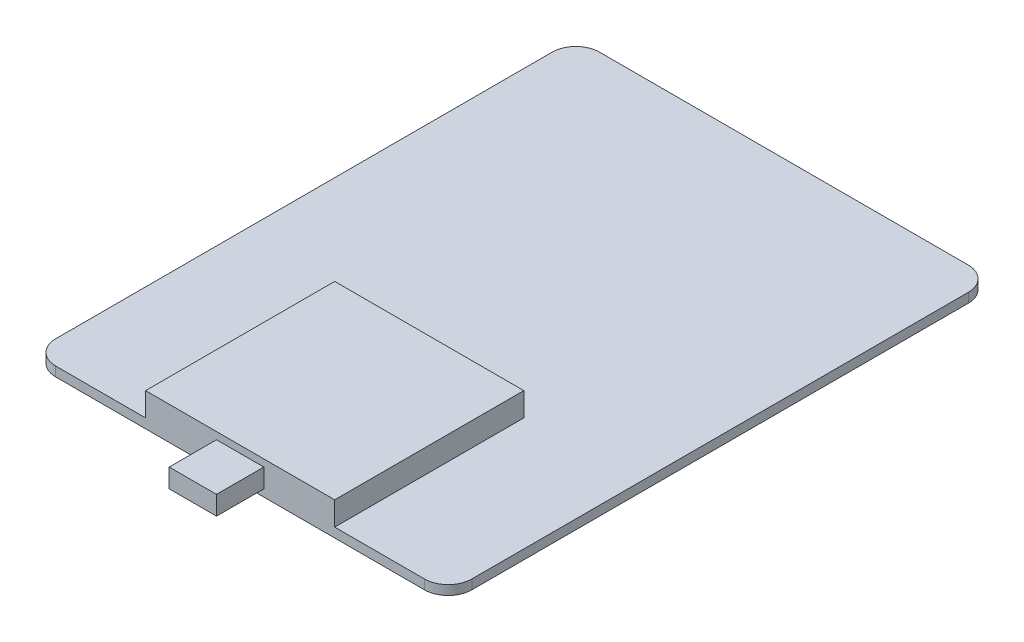
ISO-10303-21;
HEADER;
FILE_DESCRIPTION(('STEP AP214'),'2;1');
FILE_NAME('part.step','',(''),(''),'','','');
FILE_SCHEMA(('AUTOMOTIVE_DESIGN { 1 0 10303 214 1 1 1 1 }'));
ENDSEC;
DATA;
#1=APPLICATION_CONTEXT('core data for automotive mechanical design processes');
#2=APPLICATION_PROTOCOL_DEFINITION('international standard','automotive_design',2000,#1);
#3=PRODUCT_CONTEXT('',#1,'mechanical');
#4=PRODUCT('Part','Part','',(#3));
#5=PRODUCT_RELATED_PRODUCT_CATEGORY('part','',(#4));
#6=PRODUCT_DEFINITION_FORMATION('','',#4);
#7=PRODUCT_DEFINITION_CONTEXT('part definition',#1,'design');
#8=PRODUCT_DEFINITION('design','',#6,#7);
#9=PRODUCT_DEFINITION_SHAPE('','',#8);
#10=(LENGTH_UNIT() NAMED_UNIT(*) SI_UNIT(.MILLI.,.METRE.));
#11=(NAMED_UNIT(*) PLANE_ANGLE_UNIT() SI_UNIT($,.RADIAN.));
#12=(NAMED_UNIT(*) SI_UNIT($,.STERADIAN.) SOLID_ANGLE_UNIT());
#13=UNCERTAINTY_MEASURE_WITH_UNIT(LENGTH_MEASURE(1.E-05),#10,'distance_accuracy_value','');
#14=(GEOMETRIC_REPRESENTATION_CONTEXT(3) GLOBAL_UNCERTAINTY_ASSIGNED_CONTEXT((#13)) GLOBAL_UNIT_ASSIGNED_CONTEXT((#10,
#11,#12)) REPRESENTATION_CONTEXT('',''));
#15=CARTESIAN_POINT('',(0.,0.,0.));
#16=DIRECTION('',(0.,0.,1.));
#17=DIRECTION('',(1.,0.,0.));
#18=AXIS2_PLACEMENT_3D('',#15,#16,#17);
#19=CARTESIAN_POINT('',(39.,2.,57.5));
#20=DIRECTION('',(0.,0.,-1.));
#21=DIRECTION('',(-1.,0.,0.));
#22=AXIS2_PLACEMENT_3D('',#19,#20,#21);
#23=PLANE('',#22);
#24=DIRECTION('',(1.,0.,0.));
#25=VECTOR('',#24,1.);
#26=CARTESIAN_POINT('',(39.,0.,57.5));
#27=LINE('',#26,#25);
#28=CARTESIAN_POINT('',(-39.,0.,57.5));
#29=VERTEX_POINT('',#28);
#30=CARTESIAN_POINT('',(39.,0.,57.5));
#31=VERTEX_POINT('',#30);
#32=EDGE_CURVE('E232',#29,#31,#27,.T.);
#33=ORIENTED_EDGE('',*,*,#32,.T.);
#34=DIRECTION('',(0.,-1.,0.));
#35=VECTOR('',#34,1.);
#36=CARTESIAN_POINT('',(39.,2.,57.5));
#37=LINE('',#36,#35);
#38=CARTESIAN_POINT('',(39.,2.,57.5));
#39=VERTEX_POINT('',#38);
#40=EDGE_CURVE('E252',#39,#31,#37,.T.);
#41=ORIENTED_EDGE('',*,*,#40,.F.);
#42=DIRECTION('',(1.,0.,0.));
#43=VECTOR('',#42,1.);
#44=CARTESIAN_POINT('',(39.,2.,57.5));
#45=LINE('',#44,#43);
#46=CARTESIAN_POINT('',(20.,2.,57.5));
#47=VERTEX_POINT('',#46);
#48=EDGE_CURVE('E214',#47,#39,#45,.T.);
#49=ORIENTED_EDGE('',*,*,#48,.F.);
#50=DIRECTION('',(0.,-1.,0.));
#51=VECTOR('',#50,1.);
#52=CARTESIAN_POINT('',(20.,7.,57.5));
#53=LINE('',#52,#51);
#54=CARTESIAN_POINT('',(20.,7.,57.5));
#55=VERTEX_POINT('',#54);
#56=EDGE_CURVE('E188',#55,#47,#53,.T.);
#57=ORIENTED_EDGE('',*,*,#56,.F.);
#58=DIRECTION('',(1.,0.,0.));
#59=VECTOR('',#58,1.);
#60=CARTESIAN_POINT('',(20.,7.,57.5));
#61=LINE('',#60,#59);
#62=CARTESIAN_POINT('',(-20.,7.,57.5));
#63=VERTEX_POINT('',#62);
#64=EDGE_CURVE('E187',#63,#55,#61,.T.);
#65=ORIENTED_EDGE('',*,*,#64,.F.);
#66=DIRECTION('',(0.,-1.,0.));
#67=VECTOR('',#66,1.);
#68=CARTESIAN_POINT('',(-20.,7.,57.5));
#69=LINE('',#68,#67);
#70=CARTESIAN_POINT('',(-20.,2.,57.5));
#71=VERTEX_POINT('',#70);
#72=EDGE_CURVE('E196',#63,#71,#69,.T.);
#73=ORIENTED_EDGE('',*,*,#72,.T.);
#74=CARTESIAN_POINT('',(-39.,2.,57.5));
#75=VERTEX_POINT('',#74);
#76=EDGE_CURVE('E215',#75,#71,#45,.T.);
#77=ORIENTED_EDGE('',*,*,#76,.F.);
#78=DIRECTION('',(0.,-1.,0.));
#79=VECTOR('',#78,1.);
#80=CARTESIAN_POINT('',(-39.,2.,57.5));
#81=LINE('',#80,#79);
#82=EDGE_CURVE('E255',#75,#29,#81,.T.);
#83=ORIENTED_EDGE('',*,*,#82,.T.);
#84=EDGE_LOOP('',(#33,#41,#49,#57,#65,#73,#77,#83));
#85=FACE_BOUND('',#84,.T.);
#86=DIRECTION('',(0.,-1.,0.));
#87=VECTOR('',#86,1.);
#88=CARTESIAN_POINT('',(-5.,5.5,57.5));
#89=LINE('',#88,#87);
#90=CARTESIAN_POINT('',(-5.,5.5,57.5));
#91=VERTEX_POINT('',#90);
#92=CARTESIAN_POINT('',(-5.,1.5,57.5));
#93=VERTEX_POINT('',#92);
#94=EDGE_CURVE('E169',#91,#93,#89,.T.);
#95=ORIENTED_EDGE('',*,*,#94,.F.);
#96=DIRECTION('',(-1.,0.,0.));
#97=VECTOR('',#96,1.);
#98=CARTESIAN_POINT('',(5.,5.5,57.5));
#99=LINE('',#98,#97);
#100=CARTESIAN_POINT('',(5.,5.5,57.5));
#101=VERTEX_POINT('',#100);
#102=EDGE_CURVE('E166',#101,#91,#99,.T.);
#103=ORIENTED_EDGE('',*,*,#102,.F.);
#104=DIRECTION('',(0.,1.,0.));
#105=VECTOR('',#104,1.);
#106=CARTESIAN_POINT('',(5.,5.5,57.5));
#107=LINE('',#106,#105);
#108=CARTESIAN_POINT('',(5.,1.5,57.5));
#109=VERTEX_POINT('',#108);
#110=EDGE_CURVE('E56',#109,#101,#107,.T.);
#111=ORIENTED_EDGE('',*,*,#110,.F.);
#112=DIRECTION('',(1.,0.,0.));
#113=VECTOR('',#112,1.);
#114=CARTESIAN_POINT('',(5.,1.5,57.5));
#115=LINE('',#114,#113);
#116=EDGE_CURVE('E51',#93,#109,#115,.T.);
#117=ORIENTED_EDGE('',*,*,#116,.F.);
#118=EDGE_LOOP('',(#95,#103,#111,#117));
#119=FACE_BOUND('',#118,.T.);
#120=ADVANCED_FACE('F36',(#85,#119),#23,.F.);
#121=CARTESIAN_POINT('',(-39.,2.,-52.5));
#122=DIRECTION('',(0.,-1.,0.));
#123=DIRECTION('',(0.,0.,-1.));
#124=AXIS2_PLACEMENT_3D('',#121,#122,#123);
#125=CYLINDRICAL_SURFACE('',#124,5.);
#126=CARTESIAN_POINT('',(-39.,0.,-52.5));
#127=DIRECTION('',(0.,1.,0.));
#128=DIRECTION('',(0.,0.,1.));
#129=AXIS2_PLACEMENT_3D('',#126,#127,#128);
#130=CIRCLE('',#129,5.);
#131=CARTESIAN_POINT('',(-39.,0.,-57.5));
#132=VERTEX_POINT('',#131);
#133=CARTESIAN_POINT('',(-44.,0.,-52.5));
#134=VERTEX_POINT('',#133);
#135=EDGE_CURVE('E205',#132,#134,#130,.T.);
#136=ORIENTED_EDGE('',*,*,#135,.T.);
#137=DIRECTION('',(0.,-1.,0.));
#138=VECTOR('',#137,1.);
#139=CARTESIAN_POINT('',(-44.,2.,-52.5));
#140=LINE('',#139,#138);
#141=CARTESIAN_POINT('',(-44.,2.,-52.5));
#142=VERTEX_POINT('',#141);
#143=EDGE_CURVE('E11',#142,#134,#140,.T.);
#144=ORIENTED_EDGE('',*,*,#143,.F.);
#145=CARTESIAN_POINT('',(-39.,2.,-52.5));
#146=DIRECTION('',(0.,1.,0.));
#147=DIRECTION('',(0.,0.,1.));
#148=AXIS2_PLACEMENT_3D('',#145,#146,#147);
#149=CIRCLE('',#148,5.);
#150=CARTESIAN_POINT('',(-39.,2.,-57.5));
#151=VERTEX_POINT('',#150);
#152=EDGE_CURVE('E206',#151,#142,#149,.T.);
#153=ORIENTED_EDGE('',*,*,#152,.F.);
#154=DIRECTION('',(0.,-1.,0.));
#155=VECTOR('',#154,1.);
#156=CARTESIAN_POINT('',(-39.,2.,-57.5));
#157=LINE('',#156,#155);
#158=EDGE_CURVE('E225',#151,#132,#157,.T.);
#159=ORIENTED_EDGE('',*,*,#158,.T.);
#160=EDGE_LOOP('',(#136,#144,#153,#159));
#161=FACE_BOUND('',#160,.T.);
#162=ADVANCED_FACE('F38',(#161),#125,.T.);
#163=CARTESIAN_POINT('',(-44.,2.,-52.5));
#164=DIRECTION('',(1.,0.,0.));
#165=DIRECTION('',(0.,0.,-1.));
#166=AXIS2_PLACEMENT_3D('',#163,#164,#165);
#167=PLANE('',#166);
#168=DIRECTION('',(0.,0.,1.));
#169=VECTOR('',#168,1.);
#170=CARTESIAN_POINT('',(-44.,0.,-52.5));
#171=LINE('',#170,#169);
#172=CARTESIAN_POINT('',(-44.,0.,52.5));
#173=VERTEX_POINT('',#172);
#174=EDGE_CURVE('E228',#134,#173,#171,.T.);
#175=ORIENTED_EDGE('',*,*,#174,.T.);
#176=DIRECTION('',(0.,-1.,0.));
#177=VECTOR('',#176,1.);
#178=CARTESIAN_POINT('',(-44.,2.,52.5));
#179=LINE('',#178,#177);
#180=CARTESIAN_POINT('',(-44.,2.,52.5));
#181=VERTEX_POINT('',#180);
#182=EDGE_CURVE('E44',#181,#173,#179,.T.);
#183=ORIENTED_EDGE('',*,*,#182,.F.);
#184=DIRECTION('',(0.,0.,1.));
#185=VECTOR('',#184,1.);
#186=CARTESIAN_POINT('',(-44.,2.,-52.5));
#187=LINE('',#186,#185);
#188=EDGE_CURVE('E209',#142,#181,#187,.T.);
#189=ORIENTED_EDGE('',*,*,#188,.F.);
#190=ORIENTED_EDGE('',*,*,#143,.T.);
#191=EDGE_LOOP('',(#175,#183,#189,#190));
#192=FACE_BOUND('',#191,.T.);
#193=ADVANCED_FACE('F311',(#192),#167,.F.);
#194=CARTESIAN_POINT('',(-39.,2.,52.5));
#195=DIRECTION('',(0.,-1.,0.));
#196=DIRECTION('',(0.,0.,-1.));
#197=AXIS2_PLACEMENT_3D('',#194,#195,#196);
#198=CYLINDRICAL_SURFACE('',#197,5.);
#199=CARTESIAN_POINT('',(-39.,0.,52.5));
#200=DIRECTION('',(0.,1.,0.));
#201=DIRECTION('',(0.,0.,-1.));
#202=AXIS2_PLACEMENT_3D('',#199,#200,#201);
#203=CIRCLE('',#202,5.);
#204=EDGE_CURVE('E230',#173,#29,#203,.T.);
#205=ORIENTED_EDGE('',*,*,#204,.T.);
#206=ORIENTED_EDGE('',*,*,#82,.F.);
#207=CARTESIAN_POINT('',(-39.,2.,52.5));
#208=DIRECTION('',(0.,1.,0.));
#209=DIRECTION('',(0.,0.,-1.));
#210=AXIS2_PLACEMENT_3D('',#207,#208,#209);
#211=CIRCLE('',#210,5.);
#212=EDGE_CURVE('E212',#181,#75,#211,.T.);
#213=ORIENTED_EDGE('',*,*,#212,.F.);
#214=ORIENTED_EDGE('',*,*,#182,.T.);
#215=EDGE_LOOP('',(#205,#206,#213,#214));
#216=FACE_BOUND('',#215,.T.);
#217=ADVANCED_FACE('F262',(#216),#198,.T.);
#218=CARTESIAN_POINT('',(39.,2.,52.5));
#219=DIRECTION('',(0.,-1.,0.));
#220=DIRECTION('',(0.,0.,-1.));
#221=AXIS2_PLACEMENT_3D('',#218,#219,#220);
#222=CYLINDRICAL_SURFACE('',#221,5.);
#223=CARTESIAN_POINT('',(39.,0.,52.5));
#224=DIRECTION('',(0.,1.,0.));
#225=DIRECTION('',(0.,0.,-1.));
#226=AXIS2_PLACEMENT_3D('',#223,#224,#225);
#227=CIRCLE('',#226,5.);
#228=CARTESIAN_POINT('',(44.,0.,52.5));
#229=VERTEX_POINT('',#228);
#230=EDGE_CURVE('E234',#31,#229,#227,.T.);
#231=ORIENTED_EDGE('',*,*,#230,.T.);
#232=DIRECTION('',(0.,-1.,0.));
#233=VECTOR('',#232,1.);
#234=CARTESIAN_POINT('',(44.,2.,52.5));
#235=LINE('',#234,#233);
#236=CARTESIAN_POINT('',(44.,2.,52.5));
#237=VERTEX_POINT('',#236);
#238=EDGE_CURVE('E249',#237,#229,#235,.T.);
#239=ORIENTED_EDGE('',*,*,#238,.F.);
#240=CARTESIAN_POINT('',(39.,2.,52.5));
#241=DIRECTION('',(0.,1.,0.));
#242=DIRECTION('',(0.,0.,-1.));
#243=AXIS2_PLACEMENT_3D('',#240,#241,#242);
#244=CIRCLE('',#243,5.);
#245=EDGE_CURVE('E217',#39,#237,#244,.T.);
#246=ORIENTED_EDGE('',*,*,#245,.F.);
#247=ORIENTED_EDGE('',*,*,#40,.T.);
#248=EDGE_LOOP('',(#231,#239,#246,#247));
#249=FACE_BOUND('',#248,.T.);
#250=ADVANCED_FACE('F277',(#249),#222,.T.);
#251=CARTESIAN_POINT('',(44.,2.,-52.5));
#252=DIRECTION('',(-1.,0.,0.));
#253=DIRECTION('',(0.,0.,1.));
#254=AXIS2_PLACEMENT_3D('',#251,#252,#253);
#255=PLANE('',#254);
#256=DIRECTION('',(0.,0.,-1.));
#257=VECTOR('',#256,1.);
#258=CARTESIAN_POINT('',(44.,0.,-52.5));
#259=LINE('',#258,#257);
#260=CARTESIAN_POINT('',(44.,0.,-52.5));
#261=VERTEX_POINT('',#260);
#262=EDGE_CURVE('E236',#229,#261,#259,.T.);
#263=ORIENTED_EDGE('',*,*,#262,.T.);
#264=DIRECTION('',(0.,-1.,0.));
#265=VECTOR('',#264,1.);
#266=CARTESIAN_POINT('',(44.,2.,-52.5));
#267=LINE('',#266,#265);
#268=CARTESIAN_POINT('',(44.,2.,-52.5));
#269=VERTEX_POINT('',#268);
#270=EDGE_CURVE('E246',#269,#261,#267,.T.);
#271=ORIENTED_EDGE('',*,*,#270,.F.);
#272=DIRECTION('',(0.,0.,-1.));
#273=VECTOR('',#272,1.);
#274=CARTESIAN_POINT('',(44.,2.,-52.5));
#275=LINE('',#274,#273);
#276=EDGE_CURVE('E219',#237,#269,#275,.T.);
#277=ORIENTED_EDGE('',*,*,#276,.F.);
#278=ORIENTED_EDGE('',*,*,#238,.T.);
#279=EDGE_LOOP('',(#263,#271,#277,#278));
#280=FACE_BOUND('',#279,.T.);
#281=ADVANCED_FACE('F333',(#280),#255,.F.);
#282=CARTESIAN_POINT('',(39.,2.,-52.5));
#283=DIRECTION('',(0.,-1.,0.));
#284=DIRECTION('',(0.,0.,-1.));
#285=AXIS2_PLACEMENT_3D('',#282,#283,#284);
#286=CYLINDRICAL_SURFACE('',#285,5.);
#287=CARTESIAN_POINT('',(39.,0.,-52.5));
#288=DIRECTION('',(0.,1.,0.));
#289=DIRECTION('',(0.,0.,-1.));
#290=AXIS2_PLACEMENT_3D('',#287,#288,#289);
#291=CIRCLE('',#290,5.);
#292=CARTESIAN_POINT('',(39.,0.,-57.5));
#293=VERTEX_POINT('',#292);
#294=EDGE_CURVE('E238',#261,#293,#291,.T.);
#295=ORIENTED_EDGE('',*,*,#294,.T.);
#296=DIRECTION('',(0.,-1.,0.));
#297=VECTOR('',#296,1.);
#298=CARTESIAN_POINT('',(39.,2.,-57.5));
#299=LINE('',#298,#297);
#300=CARTESIAN_POINT('',(39.,2.,-57.5));
#301=VERTEX_POINT('',#300);
#302=EDGE_CURVE('E243',#301,#293,#299,.T.);
#303=ORIENTED_EDGE('',*,*,#302,.F.);
#304=CARTESIAN_POINT('',(39.,2.,-52.5));
#305=DIRECTION('',(0.,1.,0.));
#306=DIRECTION('',(0.,0.,-1.));
#307=AXIS2_PLACEMENT_3D('',#304,#305,#306);
#308=CIRCLE('',#307,5.);
#309=EDGE_CURVE('E221',#269,#301,#308,.T.);
#310=ORIENTED_EDGE('',*,*,#309,.F.);
#311=ORIENTED_EDGE('',*,*,#270,.T.);
#312=EDGE_LOOP('',(#295,#303,#310,#311));
#313=FACE_BOUND('',#312,.T.);
#314=ADVANCED_FACE('F331',(#313),#286,.T.);
#315=CARTESIAN_POINT('',(39.,2.,-57.5));
#316=DIRECTION('',(0.,0.,1.));
#317=DIRECTION('',(1.,0.,0.));
#318=AXIS2_PLACEMENT_3D('',#315,#316,#317);
#319=PLANE('',#318);
#320=DIRECTION('',(-1.,0.,0.));
#321=VECTOR('',#320,1.);
#322=CARTESIAN_POINT('',(39.,0.,-57.5));
#323=LINE('',#322,#321);
#324=EDGE_CURVE('E210',#293,#132,#323,.T.);
#325=ORIENTED_EDGE('',*,*,#324,.T.);
#326=ORIENTED_EDGE('',*,*,#158,.F.);
#327=DIRECTION('',(-1.,0.,0.));
#328=VECTOR('',#327,1.);
#329=CARTESIAN_POINT('',(39.,2.,-57.5));
#330=LINE('',#329,#328);
#331=EDGE_CURVE('E223',#301,#151,#330,.T.);
#332=ORIENTED_EDGE('',*,*,#331,.F.);
#333=ORIENTED_EDGE('',*,*,#302,.T.);
#334=EDGE_LOOP('',(#325,#326,#332,#333));
#335=FACE_BOUND('',#334,.T.);
#336=ADVANCED_FACE('F326',(#335),#319,.F.);
#337=CARTESIAN_POINT('',(-39.,2.,-52.5));
#338=DIRECTION('',(0.,1.,0.));
#339=DIRECTION('',(0.,0.,1.));
#340=AXIS2_PLACEMENT_3D('',#337,#338,#339);
#341=PLANE('',#340);
#342=DIRECTION('',(0.,0.,-1.));
#343=VECTOR('',#342,1.);
#344=CARTESIAN_POINT('',(20.,2.,57.5));
#345=LINE('',#344,#343);
#346=CARTESIAN_POINT('',(20.,2.,17.5));
#347=VERTEX_POINT('',#346);
#348=EDGE_CURVE('E170',#47,#347,#345,.T.);
#349=ORIENTED_EDGE('',*,*,#348,.F.);
#350=ORIENTED_EDGE('',*,*,#48,.T.);
#351=ORIENTED_EDGE('',*,*,#245,.T.);
#352=ORIENTED_EDGE('',*,*,#276,.T.);
#353=ORIENTED_EDGE('',*,*,#309,.T.);
#354=ORIENTED_EDGE('',*,*,#331,.T.);
#355=ORIENTED_EDGE('',*,*,#152,.T.);
#356=ORIENTED_EDGE('',*,*,#188,.T.);
#357=ORIENTED_EDGE('',*,*,#212,.T.);
#358=ORIENTED_EDGE('',*,*,#76,.T.);
#359=DIRECTION('',(0.,0.,1.));
#360=VECTOR('',#359,1.);
#361=CARTESIAN_POINT('',(-20.,2.,57.5));
#362=LINE('',#361,#360);
#363=CARTESIAN_POINT('',(-20.,2.,17.5));
#364=VERTEX_POINT('',#363);
#365=EDGE_CURVE('E183',#364,#71,#362,.T.);
#366=ORIENTED_EDGE('',*,*,#365,.F.);
#367=DIRECTION('',(-1.,0.,0.));
#368=VECTOR('',#367,1.);
#369=CARTESIAN_POINT('',(20.,2.,17.5));
#370=LINE('',#369,#368);
#371=EDGE_CURVE('E173',#347,#364,#370,.T.);
#372=ORIENTED_EDGE('',*,*,#371,.F.);
#373=EDGE_LOOP('',(#349,#350,#351,#352,#353,#354,#355,#356,#357,#358,#366,#372));
#374=FACE_BOUND('',#373,.T.);
#375=ADVANCED_FACE('F281',(#374),#341,.T.);
#376=CARTESIAN_POINT('',(-39.,0.,-52.5));
#377=DIRECTION('',(0.,1.,0.));
#378=DIRECTION('',(0.,0.,1.));
#379=AXIS2_PLACEMENT_3D('',#376,#377,#378);
#380=PLANE('',#379);
#381=ORIENTED_EDGE('',*,*,#135,.F.);
#382=ORIENTED_EDGE('',*,*,#324,.F.);
#383=ORIENTED_EDGE('',*,*,#294,.F.);
#384=ORIENTED_EDGE('',*,*,#262,.F.);
#385=ORIENTED_EDGE('',*,*,#230,.F.);
#386=ORIENTED_EDGE('',*,*,#32,.F.);
#387=ORIENTED_EDGE('',*,*,#204,.F.);
#388=ORIENTED_EDGE('',*,*,#174,.F.);
#389=EDGE_LOOP('',(#381,#382,#383,#384,#385,#386,#387,#388));
#390=FACE_BOUND('',#389,.T.);
#391=ADVANCED_FACE('F268',(#390),#380,.F.);
#392=CARTESIAN_POINT('',(20.,7.,57.5));
#393=DIRECTION('',(-1.,0.,0.));
#394=DIRECTION('',(0.,0.,1.));
#395=AXIS2_PLACEMENT_3D('',#392,#393,#394);
#396=PLANE('',#395);
#397=ORIENTED_EDGE('',*,*,#348,.T.);
#398=DIRECTION('',(0.,-1.,0.));
#399=VECTOR('',#398,1.);
#400=CARTESIAN_POINT('',(20.,7.,17.5));
#401=LINE('',#400,#399);
#402=CARTESIAN_POINT('',(20.,7.,17.5));
#403=VERTEX_POINT('',#402);
#404=EDGE_CURVE('E202',#403,#347,#401,.T.);
#405=ORIENTED_EDGE('',*,*,#404,.F.);
#406=DIRECTION('',(0.,0.,-1.));
#407=VECTOR('',#406,1.);
#408=CARTESIAN_POINT('',(20.,7.,57.5));
#409=LINE('',#408,#407);
#410=EDGE_CURVE('E179',#55,#403,#409,.T.);
#411=ORIENTED_EDGE('',*,*,#410,.F.);
#412=ORIENTED_EDGE('',*,*,#56,.T.);
#413=EDGE_LOOP('',(#397,#405,#411,#412));
#414=FACE_BOUND('',#413,.T.);
#415=ADVANCED_FACE('F287',(#414),#396,.F.);
#416=CARTESIAN_POINT('',(20.,7.,17.5));
#417=DIRECTION('',(0.,0.,1.));
#418=DIRECTION('',(1.,0.,0.));
#419=AXIS2_PLACEMENT_3D('',#416,#417,#418);
#420=PLANE('',#419);
#421=ORIENTED_EDGE('',*,*,#371,.T.);
#422=DIRECTION('',(0.,-1.,0.));
#423=VECTOR('',#422,1.);
#424=CARTESIAN_POINT('',(-20.,7.,17.5));
#425=LINE('',#424,#423);
#426=CARTESIAN_POINT('',(-20.,7.,17.5));
#427=VERTEX_POINT('',#426);
#428=EDGE_CURVE('E199',#427,#364,#425,.T.);
#429=ORIENTED_EDGE('',*,*,#428,.F.);
#430=DIRECTION('',(-1.,0.,0.));
#431=VECTOR('',#430,1.);
#432=CARTESIAN_POINT('',(20.,7.,17.5));
#433=LINE('',#432,#431);
#434=EDGE_CURVE('E182',#403,#427,#433,.T.);
#435=ORIENTED_EDGE('',*,*,#434,.F.);
#436=ORIENTED_EDGE('',*,*,#404,.T.);
#437=EDGE_LOOP('',(#421,#429,#435,#436));
#438=FACE_BOUND('',#437,.T.);
#439=ADVANCED_FACE('F297',(#438),#420,.F.);
#440=CARTESIAN_POINT('',(-20.,7.,57.5));
#441=DIRECTION('',(1.,0.,0.));
#442=DIRECTION('',(0.,0.,-1.));
#443=AXIS2_PLACEMENT_3D('',#440,#441,#442);
#444=PLANE('',#443);
#445=ORIENTED_EDGE('',*,*,#365,.T.);
#446=ORIENTED_EDGE('',*,*,#72,.F.);
#447=DIRECTION('',(0.,0.,1.));
#448=VECTOR('',#447,1.);
#449=CARTESIAN_POINT('',(-20.,7.,57.5));
#450=LINE('',#449,#448);
#451=EDGE_CURVE('E185',#427,#63,#450,.T.);
#452=ORIENTED_EDGE('',*,*,#451,.F.);
#453=ORIENTED_EDGE('',*,*,#428,.T.);
#454=EDGE_LOOP('',(#445,#446,#452,#453));
#455=FACE_BOUND('',#454,.T.);
#456=ADVANCED_FACE('F295',(#455),#444,.F.);
#457=CARTESIAN_POINT('',(0.,7.,0.));
#458=DIRECTION('',(0.,1.,0.));
#459=DIRECTION('',(0.,0.,1.));
#460=AXIS2_PLACEMENT_3D('',#457,#458,#459);
#461=PLANE('',#460);
#462=ORIENTED_EDGE('',*,*,#410,.T.);
#463=ORIENTED_EDGE('',*,*,#434,.T.);
#464=ORIENTED_EDGE('',*,*,#451,.T.);
#465=ORIENTED_EDGE('',*,*,#64,.T.);
#466=EDGE_LOOP('',(#462,#463,#464,#465));
#467=FACE_BOUND('',#466,.T.);
#468=ADVANCED_FACE('F290',(#467),#461,.T.);
#469=CARTESIAN_POINT('',(-5.,5.5,67.5));
#470=DIRECTION('',(1.,0.,0.));
#471=DIRECTION('',(0.,0.,-1.));
#472=AXIS2_PLACEMENT_3D('',#469,#470,#471);
#473=PLANE('',#472);
#474=ORIENTED_EDGE('',*,*,#94,.T.);
#475=DIRECTION('',(0.,0.,-1.));
#476=VECTOR('',#475,1.);
#477=CARTESIAN_POINT('',(-5.,1.5,67.5));
#478=LINE('',#477,#476);
#479=CARTESIAN_POINT('',(-5.,1.5,67.5));
#480=VERTEX_POINT('',#479);
#481=EDGE_CURVE('E150',#480,#93,#478,.T.);
#482=ORIENTED_EDGE('',*,*,#481,.F.);
#483=DIRECTION('',(0.,-1.,0.));
#484=VECTOR('',#483,1.);
#485=CARTESIAN_POINT('',(-5.,5.5,67.5));
#486=LINE('',#485,#484);
#487=CARTESIAN_POINT('',(-5.,5.5,67.5));
#488=VERTEX_POINT('',#487);
#489=EDGE_CURVE('E157',#488,#480,#486,.T.);
#490=ORIENTED_EDGE('',*,*,#489,.F.);
#491=DIRECTION('',(0.,0.,-1.));
#492=VECTOR('',#491,1.);
#493=CARTESIAN_POINT('',(-5.,5.5,67.5));
#494=LINE('',#493,#492);
#495=EDGE_CURVE('E441',#488,#91,#494,.T.);
#496=ORIENTED_EDGE('',*,*,#495,.T.);
#497=EDGE_LOOP('',(#474,#482,#490,#496));
#498=FACE_BOUND('',#497,.T.);
#499=ADVANCED_FACE('F168',(#498),#473,.F.);
#500=CARTESIAN_POINT('',(5.,1.5,67.5));
#501=DIRECTION('',(0.,1.,0.));
#502=DIRECTION('',(-1.,0.,0.));
#503=AXIS2_PLACEMENT_3D('',#500,#501,#502);
#504=PLANE('',#503);
#505=ORIENTED_EDGE('',*,*,#116,.T.);
#506=DIRECTION('',(0.,0.,-1.));
#507=VECTOR('',#506,1.);
#508=CARTESIAN_POINT('',(5.,1.5,67.5));
#509=LINE('',#508,#507);
#510=CARTESIAN_POINT('',(5.,1.5,67.5));
#511=VERTEX_POINT('',#510);
#512=EDGE_CURVE('E153',#511,#109,#509,.T.);
#513=ORIENTED_EDGE('',*,*,#512,.F.);
#514=DIRECTION('',(1.,0.,0.));
#515=VECTOR('',#514,1.);
#516=CARTESIAN_POINT('',(5.,1.5,67.5));
#517=LINE('',#516,#515);
#518=EDGE_CURVE('E146',#480,#511,#517,.T.);
#519=ORIENTED_EDGE('',*,*,#518,.F.);
#520=ORIENTED_EDGE('',*,*,#481,.T.);
#521=EDGE_LOOP('',(#505,#513,#519,#520));
#522=FACE_BOUND('',#521,.T.);
#523=ADVANCED_FACE('F148',(#522),#504,.F.);
#524=CARTESIAN_POINT('',(5.,5.5,67.5));
#525=DIRECTION('',(-1.,0.,0.));
#526=DIRECTION('',(0.,-1.,0.));
#527=AXIS2_PLACEMENT_3D('',#524,#525,#526);
#528=PLANE('',#527);
#529=ORIENTED_EDGE('',*,*,#110,.T.);
#530=DIRECTION('',(0.,0.,-1.));
#531=VECTOR('',#530,1.);
#532=CARTESIAN_POINT('',(5.,5.5,67.5));
#533=LINE('',#532,#531);
#534=CARTESIAN_POINT('',(5.,5.5,67.5));
#535=VERTEX_POINT('',#534);
#536=EDGE_CURVE('E175',#535,#101,#533,.T.);
#537=ORIENTED_EDGE('',*,*,#536,.F.);
#538=DIRECTION('',(0.,1.,0.));
#539=VECTOR('',#538,1.);
#540=CARTESIAN_POINT('',(5.,5.5,67.5));
#541=LINE('',#540,#539);
#542=EDGE_CURVE('E156',#511,#535,#541,.T.);
#543=ORIENTED_EDGE('',*,*,#542,.F.);
#544=ORIENTED_EDGE('',*,*,#512,.T.);
#545=EDGE_LOOP('',(#529,#537,#543,#544));
#546=FACE_BOUND('',#545,.T.);
#547=ADVANCED_FACE('F401',(#546),#528,.F.);
#548=CARTESIAN_POINT('',(5.,5.5,67.5));
#549=DIRECTION('',(0.,-1.,0.));
#550=DIRECTION('',(1.,0.,0.));
#551=AXIS2_PLACEMENT_3D('',#548,#549,#550);
#552=PLANE('',#551);
#553=ORIENTED_EDGE('',*,*,#102,.T.);
#554=ORIENTED_EDGE('',*,*,#495,.F.);
#555=DIRECTION('',(-1.,0.,0.));
#556=VECTOR('',#555,1.);
#557=CARTESIAN_POINT('',(5.,5.5,67.5));
#558=LINE('',#557,#556);
#559=EDGE_CURVE('E162',#535,#488,#558,.T.);
#560=ORIENTED_EDGE('',*,*,#559,.F.);
#561=ORIENTED_EDGE('',*,*,#536,.T.);
#562=EDGE_LOOP('',(#553,#554,#560,#561));
#563=FACE_BOUND('',#562,.T.);
#564=ADVANCED_FACE('F411',(#563),#552,.F.);
#565=CARTESIAN_POINT('',(0.,0.,67.5));
#566=DIRECTION('',(0.,0.,-1.));
#567=DIRECTION('',(-1.,0.,0.));
#568=AXIS2_PLACEMENT_3D('',#565,#566,#567);
#569=PLANE('',#568);
#570=ORIENTED_EDGE('',*,*,#489,.T.);
#571=ORIENTED_EDGE('',*,*,#518,.T.);
#572=ORIENTED_EDGE('',*,*,#542,.T.);
#573=ORIENTED_EDGE('',*,*,#559,.T.);
#574=EDGE_LOOP('',(#570,#571,#572,#573));
#575=FACE_BOUND('',#574,.T.);
#576=ADVANCED_FACE('F160',(#575),#569,.F.);
#577=CLOSED_SHELL('',(#120,#162,#193,#217,#250,#281,#314,#336,#375,#391,#415,#439,#456,#468,
#499,#523,#547,#564,#576));
#578=MANIFOLD_SOLID_BREP('B2',#577);
#579=ADVANCED_BREP_SHAPE_REPRESENTATION('',(#18,#578),#14);
#580=SHAPE_DEFINITION_REPRESENTATION(#9,#579);
ENDSEC;
END-ISO-10303-21;
